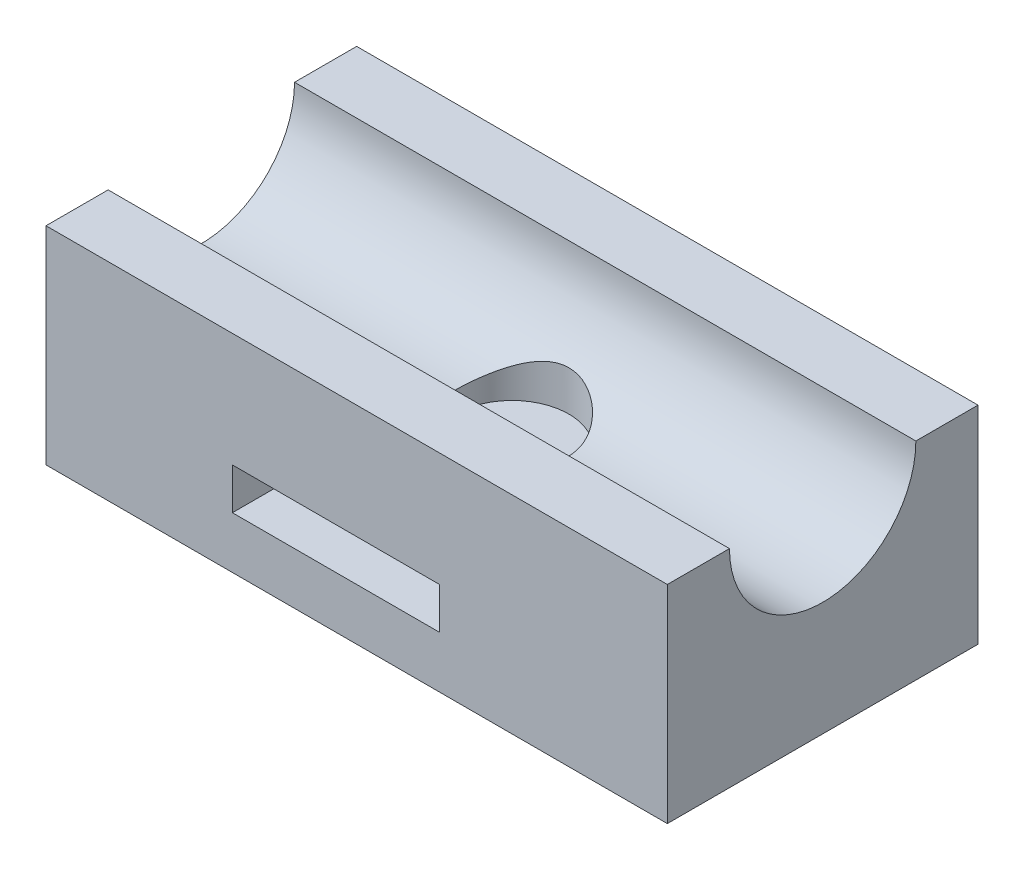
ISO-10303-21;
HEADER;
FILE_DESCRIPTION(('STEP AP214'),'2;1');
FILE_NAME('part.step','',(''),(''),'','','');
FILE_SCHEMA(('AUTOMOTIVE_DESIGN { 1 0 10303 214 1 1 1 1 }'));
ENDSEC;
DATA;
#1=APPLICATION_CONTEXT('core data for automotive mechanical design processes');
#2=APPLICATION_PROTOCOL_DEFINITION('international standard','automotive_design',2000,#1);
#3=PRODUCT_CONTEXT('',#1,'mechanical');
#4=PRODUCT('Part','Part','',(#3));
#5=PRODUCT_RELATED_PRODUCT_CATEGORY('part','',(#4));
#6=PRODUCT_DEFINITION_FORMATION('','',#4);
#7=PRODUCT_DEFINITION_CONTEXT('part definition',#1,'design');
#8=PRODUCT_DEFINITION('design','',#6,#7);
#9=PRODUCT_DEFINITION_SHAPE('','',#8);
#10=(LENGTH_UNIT() NAMED_UNIT(*) SI_UNIT(.MILLI.,.METRE.));
#11=(NAMED_UNIT(*) PLANE_ANGLE_UNIT() SI_UNIT($,.RADIAN.));
#12=(NAMED_UNIT(*) SI_UNIT($,.STERADIAN.) SOLID_ANGLE_UNIT());
#13=UNCERTAINTY_MEASURE_WITH_UNIT(LENGTH_MEASURE(1.E-05),#10,'distance_accuracy_value','');
#14=(GEOMETRIC_REPRESENTATION_CONTEXT(3) GLOBAL_UNCERTAINTY_ASSIGNED_CONTEXT((#13)) GLOBAL_UNIT_ASSIGNED_CONTEXT((#10,
#11,#12)) REPRESENTATION_CONTEXT('',''));
#15=CARTESIAN_POINT('',(0.,0.,0.));
#16=DIRECTION('',(0.,0.,1.));
#17=DIRECTION('',(1.,0.,0.));
#18=AXIS2_PLACEMENT_3D('',#15,#16,#17);
#19=CARTESIAN_POINT('',(76.189312979426,25.4,-19.05));
#20=DIRECTION('',(-1.,0.,0.));
#21=DIRECTION('',(0.,0.,1.));
#22=AXIS2_PLACEMENT_3D('',#19,#20,#21);
#23=CYLINDRICAL_SURFACE('',#22,11.43);
#24=DIRECTION('',(-1.,0.,0.));
#25=VECTOR('',#24,1.);
#26=CARTESIAN_POINT('',(76.189312979426,25.4,-30.48));
#27=LINE('',#26,#25);
#28=CARTESIAN_POINT('',(76.189312979426,25.4,-30.48));
#29=VERTEX_POINT('',#28);
#30=CARTESIAN_POINT('',(-0.0106870205739669,25.4,-30.48));
#31=VERTEX_POINT('',#30);
#32=EDGE_CURVE('E11',#29,#31,#27,.T.);
#33=ORIENTED_EDGE('',*,*,#32,.T.);
#34=CARTESIAN_POINT('',(-0.0106870205739669,25.4,-19.05));
#35=DIRECTION('',(-1.,0.,0.));
#36=DIRECTION('',(0.,0.,1.));
#37=AXIS2_PLACEMENT_3D('',#34,#35,#36);
#38=CIRCLE('',#37,11.43);
#39=CARTESIAN_POINT('',(-0.0106870205739682,25.4,-7.62000000000001));
#40=VERTEX_POINT('',#39);
#41=EDGE_CURVE('E152',#31,#40,#38,.T.);
#42=ORIENTED_EDGE('',*,*,#41,.T.);
#43=DIRECTION('',(-1.,0.,0.));
#44=VECTOR('',#43,1.);
#45=CARTESIAN_POINT('',(76.189312979426,25.4,-7.62));
#46=LINE('',#45,#44);
#47=CARTESIAN_POINT('',(76.189312979426,25.4,-7.62));
#48=VERTEX_POINT('',#47);
#49=EDGE_CURVE('E46',#40,#48,#46,.F.);
#50=ORIENTED_EDGE('',*,*,#49,.T.);
#51=CARTESIAN_POINT('',(76.189312979426,25.4,-19.05));
#52=DIRECTION('',(-1.,0.,0.));
#53=DIRECTION('',(0.,0.,1.));
#54=AXIS2_PLACEMENT_3D('',#51,#52,#53);
#55=CIRCLE('',#54,11.43);
#56=EDGE_CURVE('E156',#29,#48,#55,.T.);
#57=ORIENTED_EDGE('',*,*,#56,.F.);
#58=EDGE_LOOP('',(#33,#42,#50,#57));
#59=FACE_BOUND('',#58,.T.);
#60=CARTESIAN_POINT('',(38.089312979426,16.3526426510279,-12.065));
#61=CARTESIAN_POINT('',(38.2639668234599,16.3526396585141,-12.065001919476));
#62=CARTESIAN_POINT('',(38.4386749701658,16.3475630778701,-12.0715640351752));
#63=CARTESIAN_POINT('',(38.7866191019301,16.3274758428201,-12.0977006683469));
#64=CARTESIAN_POINT('',(38.959854017461,16.3124585072207,-12.1172839373921));
#65=CARTESIAN_POINT('',(39.3037279093829,16.2731037790766,-12.1691770968186));
#66=CARTESIAN_POINT('',(39.4743601423061,16.2487454222778,-12.2015156187813));
#67=CARTESIAN_POINT('',(39.8114888968901,16.1916920756502,-12.2784232673496));
#68=CARTESIAN_POINT('',(39.9779833257468,16.158992957784,-12.3229984509997));
#69=CARTESIAN_POINT('',(40.3043453402528,16.0867871961192,-12.4233306556903));
#70=CARTESIAN_POINT('',(40.464258543657,16.0473433809845,-12.4789851922237));
#71=CARTESIAN_POINT('',(40.7783582599086,15.962693785951,-12.6011493424653));
#72=CARTESIAN_POINT('',(40.932542579117,15.917485827685,-12.6676630627216));
#73=CARTESIAN_POINT('',(41.2345512658453,15.8225968686209,-12.8109601349127));
#74=CARTESIAN_POINT('',(41.3823781231747,15.772917642946,-12.8877394171766));
#75=CARTESIAN_POINT('',(41.67128820979,15.6703036956284,-13.0510632792636));
#76=CARTESIAN_POINT('',(41.8123712206878,15.6173688686852,-13.137608175025));
#77=CARTESIAN_POINT('',(42.2601747303282,15.441624573242,-13.4346125988456));
#78=CARTESIAN_POINT('',(42.552812437924,15.3144120855606,-13.6643990645323));
#79=CARTESIAN_POINT('',(42.9617221403863,15.1247623467679,-14.0415711564987));
#80=CARTESIAN_POINT('',(43.0931033164825,15.0616945348508,-14.1728193615056));
#81=CARTESIAN_POINT('',(43.3454297615247,14.9372383268811,-14.4458724009731));
#82=CARTESIAN_POINT('',(43.4663730606657,14.8758502493093,-14.5876792186589));
#83=CARTESIAN_POINT('',(43.7102409466186,14.7492987634795,-14.8980527684137));
#84=CARTESIAN_POINT('',(43.8318215455096,14.6845019985236,-15.067827627629));
#85=CARTESIAN_POINT('',(44.0600429002249,14.5604833680477,-15.4189638392426));
#86=CARTESIAN_POINT('',(44.1666903648136,14.5012590030553,-15.6003199350637));
#87=CARTESIAN_POINT('',(44.3639081375291,14.3900686115104,-15.9736035774017));
#88=CARTESIAN_POINT('',(44.454485719968,14.3380993031126,-16.1655262889373));
#89=CARTESIAN_POINT('',(44.6183990678219,14.2429760885947,-16.5586956966783));
#90=CARTESIAN_POINT('',(44.6917377982567,14.199820666686,-16.759940782331));
#91=CARTESIAN_POINT('',(44.8137144043605,14.1274631874209,-17.1499463506342));
#92=CARTESIAN_POINT('',(44.8640703374176,14.0973072505263,-17.3379930684081));
#93=CARTESIAN_POINT('',(44.9490709567566,14.0461548756158,-17.7188356297475));
#94=CARTESIAN_POINT('',(44.9837165789917,14.0251578919514,-17.9116311896757));
#95=CARTESIAN_POINT('',(45.0367063619675,13.9929623844108,-18.3001007278031));
#96=CARTESIAN_POINT('',(45.0550639581962,13.9817557848676,-18.4957721980466));
#97=CARTESIAN_POINT('',(45.0752039301503,13.9694584152379,-18.8882756570788));
#98=CARTESIAN_POINT('',(45.0769880875794,13.9683665577806,-19.0851075188449));
#99=CARTESIAN_POINT('',(45.0647988347553,13.975812270757,-19.4526950974293));
#100=CARTESIAN_POINT('',(45.0528239545497,13.9831285680965,-19.6235464182431));
#101=CARTESIAN_POINT('',(45.0164393917961,14.0052843097644,-19.9634280163946));
#102=CARTESIAN_POINT('',(44.9920298003194,14.0201236989938,-20.1324583070601));
#103=CARTESIAN_POINT('',(44.9310877646951,14.0569858705431,-20.4675117910474));
#104=CARTESIAN_POINT('',(44.8945554593298,14.0790085706274,-20.6335350187715));
#105=CARTESIAN_POINT('',(44.8098046734575,14.1297500968536,-20.9615207828606));
#106=CARTESIAN_POINT('',(44.7615857064554,14.1584692017533,-21.1234831498694));
#107=CARTESIAN_POINT('',(44.6537572867352,14.2221334424225,-21.4430840549721));
#108=CARTESIAN_POINT('',(44.5941014104774,14.2571039126024,-21.6007018683013));
#109=CARTESIAN_POINT('',(44.4641075833723,14.3324850339588,-21.910142877688));
#110=CARTESIAN_POINT('',(44.3937660799462,14.3728974938879,-22.0619641255161));
#111=CARTESIAN_POINT('',(44.1676187756904,14.50114798521,-22.5076398178329));
#112=CARTESIAN_POINT('',(43.996616268502,14.5960438382957,-22.7919226286299));
#113=CARTESIAN_POINT('',(43.5958120790448,14.8101908867528,-23.3633660014702));
#114=CARTESIAN_POINT('',(43.3613865346972,14.9310006864858,-23.6466635933695));
#115=CARTESIAN_POINT('',(42.8521131418012,15.1780015041597,-24.1725035279122));
#116=CARTESIAN_POINT('',(42.5772086442706,15.3041998845966,-24.414987717438));
#117=CARTESIAN_POINT('',(42.119962364464,15.4965344389314,-24.7584505521836));
#118=CARTESIAN_POINT('',(41.9498654300831,15.5647509239012,-24.8748662606916));
#119=CARTESIAN_POINT('',(41.5988184582199,15.6971720498169,-25.0928692482229));
#120=CARTESIAN_POINT('',(41.4178665311237,15.7613759882723,-25.1944539348634));
#121=CARTESIAN_POINT('',(41.0461862925386,15.8833299449572,-25.3816956794541));
#122=CARTESIAN_POINT('',(40.855473196954,15.9410895870605,-25.4673766184995));
#123=CARTESIAN_POINT('',(40.4650074043518,16.0478134453698,-25.6219355600296));
#124=CARTESIAN_POINT('',(40.265258440244,16.0967812528677,-25.6908204275158));
#125=CARTESIAN_POINT('',(39.9099788797993,16.17245923575,-25.795400436589));
#126=CARTESIAN_POINT('',(39.7561417879263,16.2016618891592,-25.8350803689406));
#127=CARTESIAN_POINT('',(39.4449946350117,16.2529226206363,-25.9040299576651));
#128=CARTESIAN_POINT('',(39.2876853825115,16.2749823436726,-25.9333020110543));
#129=CARTESIAN_POINT('',(38.9706920058058,16.3111749543637,-25.9810214982977));
#130=CARTESIAN_POINT('',(38.8110105080957,16.3253160226316,-25.9994801042345));
#131=CARTESIAN_POINT('',(38.490223143843,16.345179073953,-26.0253413297137));
#132=CARTESIAN_POINT('',(38.3291172502819,16.3509008969603,-26.0327437390825));
#133=CARTESIAN_POINT('',(38.0064194700094,16.3537040836083,-26.0363750267054));
#134=CARTESIAN_POINT('',(37.8448272270526,16.3507702158294,-26.0325842082258));
#135=CARTESIAN_POINT('',(37.5226798141752,16.336344483706,-26.0138485292706));
#136=CARTESIAN_POINT('',(37.3621246500269,16.3248525717696,-25.9989036067663));
#137=CARTESIAN_POINT('',(37.0431354686783,16.2937413662735,-25.9580828479593));
#138=CARTESIAN_POINT('',(36.8847025534814,16.2741180073035,-25.9322015437593));
#139=CARTESIAN_POINT('',(36.5709929761496,16.2274380664324,-25.8698621652715));
#140=CARTESIAN_POINT('',(36.4157176370165,16.2003784350051,-25.8333997514536));
#141=CARTESIAN_POINT('',(36.1104701606137,16.1399627622437,-25.7506870600189));
#142=CARTESIAN_POINT('',(35.9604650856894,16.1066599077936,-25.7045190891002));
#143=CARTESIAN_POINT('',(35.665047550913,16.0345742992433,-25.602678156496));
#144=CARTESIAN_POINT('',(35.5196366111133,15.9957897541853,-25.5470020871162));
#145=CARTESIAN_POINT('',(35.0911249823598,15.8727249090737,-25.3664193283414));
#146=CARTESIAN_POINT('',(34.8155970415561,15.781702315826,-25.2279172715139));
#147=CARTESIAN_POINT('',(34.238815933719,15.5716792831293,-24.8891423591995));
#148=CARTESIAN_POINT('',(33.9422396060329,15.4506186442418,-24.6821813028272));
#149=CARTESIAN_POINT('',(33.5244597849131,15.2670356932766,-24.3400666448813));
#150=CARTESIAN_POINT('',(33.3896180215879,15.2054598699312,-24.2206425257286));
#151=CARTESIAN_POINT('',(33.1293621519273,15.0828981506216,-23.9715397605156));
#152=CARTESIAN_POINT('',(33.0039497532065,15.0219123632441,-23.8418592657559));
#153=CARTESIAN_POINT('',(32.7458572202698,14.8931949882111,-23.5533710579603));
#154=CARTESIAN_POINT('',(32.6147162669765,14.8257510545812,-23.3930538832854));
#155=CARTESIAN_POINT('',(32.3665074643235,14.6951390805224,-23.060333655113));
#156=CARTESIAN_POINT('',(32.2494340842889,14.6319693639782,-22.8879353937848));
#157=CARTESIAN_POINT('',(32.0303796048417,14.5116128005951,-22.5318437407308));
#158=CARTESIAN_POINT('',(31.9283961562053,14.4544250228859,-22.3481521134899));
#159=CARTESIAN_POINT('',(31.740677249753,14.3476749620206,-21.9705290112218));
#160=CARTESIAN_POINT('',(31.6549396325128,14.2981116655701,-21.7765989014993));
#161=CARTESIAN_POINT('',(31.5061032863626,14.2111694143295,-21.393276651954));
#162=CARTESIAN_POINT('',(31.4418668995596,14.1731937523883,-21.2044621355291));
#163=CARTESIAN_POINT('',(31.3294722065202,14.1062813702306,-20.8205294884463));
#164=CARTESIAN_POINT('',(31.2813133903316,14.077344363326,-20.6254115579369));
#165=CARTESIAN_POINT('',(31.2018982466478,14.0294171404126,-20.2307681525804));
#166=CARTESIAN_POINT('',(31.1706245013598,14.0104166750035,-20.0312474414863));
#167=CARTESIAN_POINT('',(31.1254640426874,13.9829276062212,-19.6295391971772));
#168=CARTESIAN_POINT('',(31.1115748043633,13.9744374763204,-19.4273520555485));
#169=CARTESIAN_POINT('',(31.1021402490535,13.9686722387056,-19.0507501759414));
#170=CARTESIAN_POINT('',(31.104299489276,13.9699937261465,-18.8764092177358));
#171=CARTESIAN_POINT('',(31.1216238070552,13.9805727668959,-18.5286171052391));
#172=CARTESIAN_POINT('',(31.1367884428604,13.9898300506508,-18.3551659209266));
#173=CARTESIAN_POINT('',(31.1799154284448,14.0160570259333,-18.0104707834157));
#174=CARTESIAN_POINT('',(31.2078769957476,14.0330262459092,-17.8392266959211));
#175=CARTESIAN_POINT('',(31.2762317518109,14.0742766545714,-17.500139617793));
#176=CARTESIAN_POINT('',(31.3166252681202,14.0985580359135,-17.3322967168958));
#177=CARTESIAN_POINT('',(31.408235810001,14.1532161200772,-17.0051073533325));
#178=CARTESIAN_POINT('',(31.4591668178175,14.1834308497376,-16.8456535599444));
#179=CARTESIAN_POINT('',(31.5718752833561,14.2496815415154,-16.5318535891727));
#180=CARTESIAN_POINT('',(31.6336562792458,14.2857194022411,-16.3775090974991));
#181=CARTESIAN_POINT('',(31.8344136679747,14.4015272485442,-15.9233635629082));
#182=CARTESIAN_POINT('',(31.9888727224234,14.4890332292365,-15.6322100134547));
#183=CARTESIAN_POINT('',(32.3528230135778,14.6884929818972,-15.0482718930783));
#184=CARTESIAN_POINT('',(32.5664311347202,14.802059988633,-14.7586375179379));
#185=CARTESIAN_POINT('',(33.033606437667,15.0378533678655,-14.2169793326229));
#186=CARTESIAN_POINT('',(33.2872198306979,15.1600896635027,-13.9649996822162));
#187=CARTESIAN_POINT('',(33.7126370651777,15.3505687359981,-13.6024395221735));
#188=CARTESIAN_POINT('',(33.8724441311186,15.4193214204503,-13.477804567046));
#189=CARTESIAN_POINT('',(34.2029606306686,15.5544108077466,-13.2424456007179));
#190=CARTESIAN_POINT('',(34.3736720009311,15.6207470781212,-13.1317240710237));
#191=CARTESIAN_POINT('',(34.9010812068177,15.8129033205899,-12.8217254159522));
#192=CARTESIAN_POINT('',(35.2735777460187,15.9321174312719,-12.6441661721718));
#193=CARTESIAN_POINT('',(35.9659845285107,16.1113972258702,-12.3877343837164));
#194=CARTESIAN_POINT('',(36.2791167360396,16.1787236007496,-12.295687835068));
#195=CARTESIAN_POINT('',(36.759195346841,16.2567584339156,-12.1908571094342));
#196=CARTESIAN_POINT('',(36.9207767626856,16.2789329905398,-12.1614668466057));
#197=CARTESIAN_POINT('',(37.2464876826946,16.3149066492001,-12.1140865127403));
#198=CARTESIAN_POINT('',(37.4106156523887,16.3287106083258,-12.0960898302424));
#199=CARTESIAN_POINT('',(37.6607927284791,16.3429028460204,-12.0776300608214));
#200=CARTESIAN_POINT('',(37.7463738090045,16.3465504507111,-12.0728969109518));
#201=CARTESIAN_POINT('',(37.9177365289871,16.3514213114454,-12.0665811190005));
#202=CARTESIAN_POINT('',(38.0035182024673,16.352644121033,-12.0649990571005));
#203=CARTESIAN_POINT('',(38.089312979426,16.3526426510279,-12.065));
#204=B_SPLINE_CURVE_WITH_KNOTS('',3,(#60,#61,#62,#63,#64,#65,#66,#67,#68,#69,#70,#71,#72,#73,
#74,#75,#76,#77,#78,#79,#80,#81,#82,#83,#84,#85,#86,#87,#88,#89,#90,#91,#92,#93,#94,#95,#96,#97,
#98,#99,#100,#101,#102,#103,#104,#105,#106,#107,#108,#109,#110,#111,#112,#113,#114,#115,#116,
#117,#118,#119,#120,#121,#122,#123,#124,#125,#126,#127,#128,#129,#130,#131,#132,#133,#134,#135,
#136,#137,#138,#139,#140,#141,#142,#143,#144,#145,#146,#147,#148,#149,#150,#151,#152,#153,#154,
#155,#156,#157,#158,#159,#160,#161,#162,#163,#164,#165,#166,#167,#168,#169,#170,#171,#172,#173,
#174,#175,#176,#177,#178,#179,#180,#181,#182,#183,#184,#185,#186,#187,#188,#189,#190,#191,#192,
#193,#194,#195,#196,#197,#198,#199,#200,#201,#202,#203),.UNSPECIFIED.,.T.,.F.,(4,2,2,2,2,2,2,2,
2,2,2,2,2,2,2,2,2,2,2,2,2,2,2,2,2,2,2,2,2,2,2,2,2,2,2,2,2,2,2,2,2,2,2,2,2,2,2,2,2,2,2,2,2,2,2,2,
2,2,2,2,2,2,2,2,2,2,2,2,2,2,2,4),(0.,0.523861785478041,1.04807601707671,1.57347370527915,
2.09913193131605,2.62013658879214,3.14133872959329,3.66233485475122,4.18334784007696,
5.35753640255449,5.94549827306377,6.53357086046463,7.18863948984786,7.84341287654365,
8.49788910819977,9.1522526898251,9.74237959585624,10.3324713400256,10.9220758820628,
11.5116170387761,12.0252810378654,12.5389412749487,13.0525956317858,13.5662713748274,
14.0820780998549,14.5980566885237,15.6293220268434,16.7861345076548,17.9445815736102,
18.5952497750597,19.2460315739933,19.8958281093924,20.5453586087656,21.0294786436669,
21.5134871095852,21.9969946286176,22.4805113388018,22.964879400579,23.4492501559794,
23.9338633708339,24.4186756170823,24.8995313351113,25.3805445212912,26.342104181375,
27.4816288375172,28.0522948729933,28.623064005794,29.2757301136427,29.9281387799917,
30.5804457712453,31.2326659957949,31.8408510410007,32.4490167938237,33.0565539888782,
33.6640029344988,34.1864290776008,34.7088374762689,35.2312139362092,35.7536041605579,
36.2633348515542,36.7732320747906,37.7922743761094,38.9202079556135,40.0494541152898,
40.690798867635,41.3322578441178,42.6130069001315,43.6083644804034,44.1050029037086,
44.6013528731318,44.8586408379598,45.1159761705483),.UNSPECIFIED.);
#205=CARTESIAN_POINT('',(38.089312979426,16.3526426510279,-12.065));
#206=VERTEX_POINT('',#205);
#207=EDGE_CURVE('E197',#206,#206,#204,.T.);
#208=ORIENTED_EDGE('',*,*,#207,.F.);
#209=EDGE_LOOP('',(#208));
#210=FACE_BOUND('',#209,.T.);
#211=ADVANCED_FACE('F37',(#59,#210),#23,.F.);
#212=CARTESIAN_POINT('',(48.249312979426,11.43,0.));
#213=DIRECTION('',(0.,1.,0.));
#214=DIRECTION('',(0.,0.,1.));
#215=AXIS2_PLACEMENT_3D('',#212,#213,#214);
#216=PLANE('',#215);
#217=DIRECTION('',(1.,0.,0.));
#218=VECTOR('',#217,1.);
#219=CARTESIAN_POINT('',(48.249312979426,11.43,-38.1));
#220=LINE('',#219,#218);
#221=CARTESIAN_POINT('',(22.849312979426,11.43,-38.1));
#222=VERTEX_POINT('',#221);
#223=CARTESIAN_POINT('',(48.249312979426,11.43,-38.1));
#224=VERTEX_POINT('',#223);
#225=EDGE_CURVE('E133',#222,#224,#220,.T.);
#226=ORIENTED_EDGE('',*,*,#225,.T.);
#227=DIRECTION('',(0.,0.,-1.));
#228=VECTOR('',#227,1.);
#229=CARTESIAN_POINT('',(48.249312979426,11.43,0.));
#230=LINE('',#229,#228);
#231=CARTESIAN_POINT('',(48.249312979426,11.43,0.));
#232=VERTEX_POINT('',#231);
#233=EDGE_CURVE('E150',#232,#224,#230,.T.);
#234=ORIENTED_EDGE('',*,*,#233,.F.);
#235=DIRECTION('',(1.,0.,0.));
#236=VECTOR('',#235,1.);
#237=CARTESIAN_POINT('',(48.249312979426,11.43,0.));
#238=LINE('',#237,#236);
#239=CARTESIAN_POINT('',(22.849312979426,11.43,0.));
#240=VERTEX_POINT('',#239);
#241=EDGE_CURVE('E123',#240,#232,#238,.T.);
#242=ORIENTED_EDGE('',*,*,#241,.F.);
#243=DIRECTION('',(0.,0.,-1.));
#244=VECTOR('',#243,1.);
#245=CARTESIAN_POINT('',(22.849312979426,11.43,0.));
#246=LINE('',#245,#244);
#247=EDGE_CURVE('E153',#240,#222,#246,.T.);
#248=ORIENTED_EDGE('',*,*,#247,.T.);
#249=EDGE_LOOP('',(#226,#234,#242,#248));
#250=FACE_BOUND('',#249,.T.);
#251=CARTESIAN_POINT('',(38.089312979426,11.43,-19.05));
#252=DIRECTION('',(0.,1.,0.));
#253=DIRECTION('',(0.,0.,1.));
#254=AXIS2_PLACEMENT_3D('',#251,#252,#253);
#255=CIRCLE('',#254,6.985);
#256=CARTESIAN_POINT('',(38.089312979426,11.43,-12.065));
#257=VERTEX_POINT('',#256);
#258=EDGE_CURVE('E41',#257,#257,#255,.F.);
#259=ORIENTED_EDGE('',*,*,#258,.F.);
#260=EDGE_LOOP('',(#259));
#261=FACE_BOUND('',#260,.T.);
#262=ADVANCED_FACE('F220',(#250,#261),#216,.F.);
#263=CARTESIAN_POINT('',(0.,25.4,0.));
#264=DIRECTION('',(0.,1.,0.));
#265=DIRECTION('',(0.,0.,1.));
#266=AXIS2_PLACEMENT_3D('',#263,#264,#265);
#267=PLANE('',#266);
#268=ORIENTED_EDGE('',*,*,#32,.F.);
#269=DIRECTION('',(0.,0.,-1.));
#270=VECTOR('',#269,1.);
#271=CARTESIAN_POINT('',(76.189312979426,25.4,-38.1));
#272=LINE('',#271,#270);
#273=CARTESIAN_POINT('',(76.189312979426,25.4,-38.1));
#274=VERTEX_POINT('',#273);
#275=EDGE_CURVE('E167',#29,#274,#272,.T.);
#276=ORIENTED_EDGE('',*,*,#275,.T.);
#277=DIRECTION('',(-1.,0.,0.));
#278=VECTOR('',#277,1.);
#279=CARTESIAN_POINT('',(-0.0106870205739731,25.4,-38.1));
#280=LINE('',#279,#278);
#281=CARTESIAN_POINT('',(-0.0106870205739731,25.4,-38.1));
#282=VERTEX_POINT('',#281);
#283=EDGE_CURVE('E171',#274,#282,#280,.T.);
#284=ORIENTED_EDGE('',*,*,#283,.T.);
#285=DIRECTION('',(0.,0.,1.));
#286=VECTOR('',#285,1.);
#287=CARTESIAN_POINT('',(-0.0106870205739731,25.4,-38.1));
#288=LINE('',#287,#286);
#289=EDGE_CURVE('E161',#282,#31,#288,.T.);
#290=ORIENTED_EDGE('',*,*,#289,.T.);
#291=EDGE_LOOP('',(#268,#276,#284,#290));
#292=FACE_BOUND('',#291,.T.);
#293=ADVANCED_FACE('F223',(#292),#267,.T.);
#294=CARTESIAN_POINT('',(-0.0106870205739731,25.4,-38.1));
#295=DIRECTION('',(1.,0.,0.));
#296=DIRECTION('',(0.,0.,-1.));
#297=AXIS2_PLACEMENT_3D('',#294,#295,#296);
#298=PLANE('',#297);
#299=CARTESIAN_POINT('',(-0.0106870205739669,25.4,0.));
#300=VERTEX_POINT('',#299);
#301=EDGE_CURVE('E165',#40,#300,#288,.T.);
#302=ORIENTED_EDGE('',*,*,#301,.F.);
#303=ORIENTED_EDGE('',*,*,#41,.F.);
#304=ORIENTED_EDGE('',*,*,#289,.F.);
#305=DIRECTION('',(0.,-1.,0.));
#306=VECTOR('',#305,1.);
#307=CARTESIAN_POINT('',(-0.0106870205739731,25.4,-38.1));
#308=LINE('',#307,#306);
#309=CARTESIAN_POINT('',(-0.0106870205739731,0.,-38.1));
#310=VERTEX_POINT('',#309);
#311=EDGE_CURVE('E173',#282,#310,#308,.T.);
#312=ORIENTED_EDGE('',*,*,#311,.T.);
#313=DIRECTION('',(0.,0.,1.));
#314=VECTOR('',#313,1.);
#315=CARTESIAN_POINT('',(-0.0106870205739731,0.,-38.1));
#316=LINE('',#315,#314);
#317=CARTESIAN_POINT('',(-0.0106870205739669,0.,0.));
#318=VERTEX_POINT('',#317);
#319=EDGE_CURVE('E159',#310,#318,#316,.T.);
#320=ORIENTED_EDGE('',*,*,#319,.T.);
#321=DIRECTION('',(0.,-1.,0.));
#322=VECTOR('',#321,1.);
#323=CARTESIAN_POINT('',(-0.0106870205739669,25.4,0.));
#324=LINE('',#323,#322);
#325=EDGE_CURVE('E190',#300,#318,#324,.T.);
#326=ORIENTED_EDGE('',*,*,#325,.F.);
#327=EDGE_LOOP('',(#302,#303,#304,#312,#320,#326));
#328=FACE_BOUND('',#327,.T.);
#329=ADVANCED_FACE('F39',(#328),#298,.F.);
#330=CARTESIAN_POINT('',(-0.0106870205739669,25.4,0.));
#331=DIRECTION('',(0.,0.,-1.));
#332=DIRECTION('',(-1.,0.,0.));
#333=AXIS2_PLACEMENT_3D('',#330,#331,#332);
#334=PLANE('',#333);
#335=ORIENTED_EDGE('',*,*,#241,.T.);
#336=DIRECTION('',(0.,-1.,0.));
#337=VECTOR('',#336,1.);
#338=CARTESIAN_POINT('',(48.249312979426,11.43,0.));
#339=LINE('',#338,#337);
#340=CARTESIAN_POINT('',(48.249312979426,6.35,0.));
#341=VERTEX_POINT('',#340);
#342=EDGE_CURVE('E117',#232,#341,#339,.T.);
#343=ORIENTED_EDGE('',*,*,#342,.T.);
#344=DIRECTION('',(-1.,0.,0.));
#345=VECTOR('',#344,1.);
#346=CARTESIAN_POINT('',(48.249312979426,6.35,0.));
#347=LINE('',#346,#345);
#348=CARTESIAN_POINT('',(22.849312979426,6.35,0.));
#349=VERTEX_POINT('',#348);
#350=EDGE_CURVE('E126',#341,#349,#347,.T.);
#351=ORIENTED_EDGE('',*,*,#350,.T.);
#352=DIRECTION('',(0.,1.,0.));
#353=VECTOR('',#352,1.);
#354=CARTESIAN_POINT('',(22.849312979426,11.43,0.));
#355=LINE('',#354,#353);
#356=EDGE_CURVE('E54',#349,#240,#355,.T.);
#357=ORIENTED_EDGE('',*,*,#356,.T.);
#358=EDGE_LOOP('',(#335,#343,#351,#357));
#359=FACE_BOUND('',#358,.T.);
#360=DIRECTION('',(1.,0.,0.));
#361=VECTOR('',#360,1.);
#362=CARTESIAN_POINT('',(-0.0106870205739669,0.,0.));
#363=LINE('',#362,#361);
#364=CARTESIAN_POINT('',(76.189312979426,0.,0.));
#365=VERTEX_POINT('',#364);
#366=EDGE_CURVE('E176',#318,#365,#363,.T.);
#367=ORIENTED_EDGE('',*,*,#366,.T.);
#368=DIRECTION('',(0.,-1.,0.));
#369=VECTOR('',#368,1.);
#370=CARTESIAN_POINT('',(76.189312979426,25.4,0.));
#371=LINE('',#370,#369);
#372=CARTESIAN_POINT('',(76.189312979426,25.4,0.));
#373=VERTEX_POINT('',#372);
#374=EDGE_CURVE('E187',#373,#365,#371,.T.);
#375=ORIENTED_EDGE('',*,*,#374,.F.);
#376=DIRECTION('',(1.,0.,0.));
#377=VECTOR('',#376,1.);
#378=CARTESIAN_POINT('',(-0.0106870205739669,25.4,0.));
#379=LINE('',#378,#377);
#380=EDGE_CURVE('E164',#300,#373,#379,.T.);
#381=ORIENTED_EDGE('',*,*,#380,.F.);
#382=ORIENTED_EDGE('',*,*,#325,.T.);
#383=EDGE_LOOP('',(#367,#375,#381,#382));
#384=FACE_BOUND('',#383,.T.);
#385=ADVANCED_FACE('F130',(#359,#384),#334,.F.);
#386=CARTESIAN_POINT('',(76.189312979426,25.4,-38.1));
#387=DIRECTION('',(-1.,0.,0.));
#388=DIRECTION('',(0.,0.,1.));
#389=AXIS2_PLACEMENT_3D('',#386,#387,#388);
#390=PLANE('',#389);
#391=ORIENTED_EDGE('',*,*,#275,.F.);
#392=ORIENTED_EDGE('',*,*,#56,.T.);
#393=EDGE_CURVE('E168',#373,#48,#272,.T.);
#394=ORIENTED_EDGE('',*,*,#393,.F.);
#395=ORIENTED_EDGE('',*,*,#374,.T.);
#396=DIRECTION('',(0.,0.,-1.));
#397=VECTOR('',#396,1.);
#398=CARTESIAN_POINT('',(76.189312979426,0.,-38.1));
#399=LINE('',#398,#397);
#400=CARTESIAN_POINT('',(76.189312979426,0.,-38.1));
#401=VERTEX_POINT('',#400);
#402=EDGE_CURVE('E178',#365,#401,#399,.T.);
#403=ORIENTED_EDGE('',*,*,#402,.T.);
#404=DIRECTION('',(0.,-1.,0.));
#405=VECTOR('',#404,1.);
#406=CARTESIAN_POINT('',(76.189312979426,25.4,-38.1));
#407=LINE('',#406,#405);
#408=EDGE_CURVE('E184',#274,#401,#407,.T.);
#409=ORIENTED_EDGE('',*,*,#408,.F.);
#410=EDGE_LOOP('',(#391,#392,#394,#395,#403,#409));
#411=FACE_BOUND('',#410,.T.);
#412=ADVANCED_FACE('F265',(#411),#390,.F.);
#413=CARTESIAN_POINT('',(-0.0106870205739731,25.4,-38.1));
#414=DIRECTION('',(0.,0.,1.));
#415=DIRECTION('',(1.,0.,0.));
#416=AXIS2_PLACEMENT_3D('',#413,#414,#415);
#417=PLANE('',#416);
#418=DIRECTION('',(-1.,0.,0.));
#419=VECTOR('',#418,1.);
#420=CARTESIAN_POINT('',(48.249312979426,6.35,-38.1));
#421=LINE('',#420,#419);
#422=CARTESIAN_POINT('',(48.249312979426,6.35,-38.1));
#423=VERTEX_POINT('',#422);
#424=CARTESIAN_POINT('',(22.849312979426,6.35,-38.1));
#425=VERTEX_POINT('',#424);
#426=EDGE_CURVE('E145',#423,#425,#421,.T.);
#427=ORIENTED_EDGE('',*,*,#426,.F.);
#428=DIRECTION('',(0.,-1.,0.));
#429=VECTOR('',#428,1.);
#430=CARTESIAN_POINT('',(48.249312979426,11.43,-38.1));
#431=LINE('',#430,#429);
#432=EDGE_CURVE('E62',#224,#423,#431,.T.);
#433=ORIENTED_EDGE('',*,*,#432,.F.);
#434=ORIENTED_EDGE('',*,*,#225,.F.);
#435=DIRECTION('',(0.,1.,0.));
#436=VECTOR('',#435,1.);
#437=CARTESIAN_POINT('',(22.849312979426,11.43,-38.1));
#438=LINE('',#437,#436);
#439=EDGE_CURVE('E136',#425,#222,#438,.T.);
#440=ORIENTED_EDGE('',*,*,#439,.F.);
#441=EDGE_LOOP('',(#427,#433,#434,#440));
#442=FACE_BOUND('',#441,.T.);
#443=DIRECTION('',(-1.,0.,0.));
#444=VECTOR('',#443,1.);
#445=CARTESIAN_POINT('',(-0.0106870205739731,0.,-38.1));
#446=LINE('',#445,#444);
#447=EDGE_CURVE('E180',#401,#310,#446,.T.);
#448=ORIENTED_EDGE('',*,*,#447,.T.);
#449=ORIENTED_EDGE('',*,*,#311,.F.);
#450=ORIENTED_EDGE('',*,*,#283,.F.);
#451=ORIENTED_EDGE('',*,*,#408,.T.);
#452=EDGE_LOOP('',(#448,#449,#450,#451));
#453=FACE_BOUND('',#452,.T.);
#454=ADVANCED_FACE('F255',(#442,#453),#417,.F.);
#455=ORIENTED_EDGE('',*,*,#49,.F.);
#456=ORIENTED_EDGE('',*,*,#301,.T.);
#457=ORIENTED_EDGE('',*,*,#380,.T.);
#458=ORIENTED_EDGE('',*,*,#393,.T.);
#459=EDGE_LOOP('',(#455,#456,#457,#458));
#460=FACE_BOUND('',#459,.T.);
#461=ADVANCED_FACE('F234',(#460),#267,.T.);
#462=CARTESIAN_POINT('',(0.,0.,0.));
#463=DIRECTION('',(0.,1.,0.));
#464=DIRECTION('',(0.,0.,1.));
#465=AXIS2_PLACEMENT_3D('',#462,#463,#464);
#466=PLANE('',#465);
#467=CARTESIAN_POINT('',(38.089312979426,0.,-19.05));
#468=DIRECTION('',(0.,-1.,0.));
#469=DIRECTION('',(0.,0.,-1.));
#470=AXIS2_PLACEMENT_3D('',#467,#468,#469);
#471=CIRCLE('',#470,3.302);
#472=CARTESIAN_POINT('',(38.089312979426,0.,-22.352));
#473=VERTEX_POINT('',#472);
#474=EDGE_CURVE('E139',#473,#473,#471,.T.);
#475=ORIENTED_EDGE('',*,*,#474,.F.);
#476=EDGE_LOOP('',(#475));
#477=FACE_BOUND('',#476,.T.);
#478=ORIENTED_EDGE('',*,*,#319,.F.);
#479=ORIENTED_EDGE('',*,*,#447,.F.);
#480=ORIENTED_EDGE('',*,*,#402,.F.);
#481=ORIENTED_EDGE('',*,*,#366,.F.);
#482=EDGE_LOOP('',(#478,#479,#480,#481));
#483=FACE_BOUND('',#482,.T.);
#484=ADVANCED_FACE('F230',(#477,#483),#466,.F.);
#485=CARTESIAN_POINT('',(48.249312979426,11.43,0.));
#486=DIRECTION('',(1.,0.,0.));
#487=DIRECTION('',(0.,1.,0.));
#488=AXIS2_PLACEMENT_3D('',#485,#486,#487);
#489=PLANE('',#488);
#490=ORIENTED_EDGE('',*,*,#432,.T.);
#491=DIRECTION('',(0.,0.,-1.));
#492=VECTOR('',#491,1.);
#493=CARTESIAN_POINT('',(48.249312979426,6.35,0.));
#494=LINE('',#493,#492);
#495=EDGE_CURVE('E113',#341,#423,#494,.T.);
#496=ORIENTED_EDGE('',*,*,#495,.F.);
#497=ORIENTED_EDGE('',*,*,#342,.F.);
#498=ORIENTED_EDGE('',*,*,#233,.T.);
#499=EDGE_LOOP('',(#490,#496,#497,#498));
#500=FACE_BOUND('',#499,.T.);
#501=ADVANCED_FACE('F115',(#500),#489,.F.);
#502=CARTESIAN_POINT('',(22.849312979426,11.43,0.));
#503=DIRECTION('',(-1.,0.,0.));
#504=DIRECTION('',(0.,0.,1.));
#505=AXIS2_PLACEMENT_3D('',#502,#503,#504);
#506=PLANE('',#505);
#507=ORIENTED_EDGE('',*,*,#439,.T.);
#508=ORIENTED_EDGE('',*,*,#247,.F.);
#509=ORIENTED_EDGE('',*,*,#356,.F.);
#510=DIRECTION('',(0.,0.,-1.));
#511=VECTOR('',#510,1.);
#512=CARTESIAN_POINT('',(22.849312979426,6.35,0.));
#513=LINE('',#512,#511);
#514=EDGE_CURVE('E122',#349,#425,#513,.T.);
#515=ORIENTED_EDGE('',*,*,#514,.T.);
#516=EDGE_LOOP('',(#507,#508,#509,#515));
#517=FACE_BOUND('',#516,.T.);
#518=ADVANCED_FACE('F225',(#517),#506,.F.);
#519=CARTESIAN_POINT('',(48.249312979426,6.35,0.));
#520=DIRECTION('',(0.,-1.,0.));
#521=DIRECTION('',(0.,0.,-1.));
#522=AXIS2_PLACEMENT_3D('',#519,#520,#521);
#523=PLANE('',#522);
#524=CARTESIAN_POINT('',(38.089312979426,6.35,-19.05));
#525=DIRECTION('',(0.,-1.,0.));
#526=DIRECTION('',(0.,0.,-1.));
#527=AXIS2_PLACEMENT_3D('',#524,#525,#526);
#528=CIRCLE('',#527,3.302);
#529=CARTESIAN_POINT('',(38.089312979426,6.35,-22.352));
#530=VERTEX_POINT('',#529);
#531=EDGE_CURVE('E146',#530,#530,#528,.T.);
#532=ORIENTED_EDGE('',*,*,#531,.T.);
#533=EDGE_LOOP('',(#532));
#534=FACE_BOUND('',#533,.T.);
#535=ORIENTED_EDGE('',*,*,#426,.T.);
#536=ORIENTED_EDGE('',*,*,#514,.F.);
#537=ORIENTED_EDGE('',*,*,#350,.F.);
#538=ORIENTED_EDGE('',*,*,#495,.T.);
#539=EDGE_LOOP('',(#535,#536,#537,#538));
#540=FACE_BOUND('',#539,.T.);
#541=ADVANCED_FACE('F127',(#534,#540),#523,.F.);
#542=CARTESIAN_POINT('',(38.089312979426,25.4,-19.05));
#543=DIRECTION('',(0.,-1.,0.));
#544=DIRECTION('',(0.,0.,-1.));
#545=AXIS2_PLACEMENT_3D('',#542,#543,#544);
#546=CYLINDRICAL_SURFACE('',#545,3.302);
#547=ORIENTED_EDGE('',*,*,#474,.T.);
#548=EDGE_LOOP('',(#547));
#549=FACE_BOUND('',#548,.T.);
#550=ORIENTED_EDGE('',*,*,#531,.F.);
#551=EDGE_LOOP('',(#550));
#552=FACE_BOUND('',#551,.T.);
#553=ADVANCED_FACE('F216',(#549,#552),#546,.F.);
#554=CARTESIAN_POINT('',(38.089312979426,7.62,-19.05));
#555=DIRECTION('',(0.,1.,0.));
#556=DIRECTION('',(0.,0.,1.));
#557=AXIS2_PLACEMENT_3D('',#554,#555,#556);
#558=CYLINDRICAL_SURFACE('',#557,6.985);
#559=ORIENTED_EDGE('',*,*,#258,.T.);
#560=EDGE_LOOP('',(#559));
#561=FACE_BOUND('',#560,.T.);
#562=ORIENTED_EDGE('',*,*,#207,.T.);
#563=EDGE_LOOP('',(#562));
#564=FACE_BOUND('',#563,.T.);
#565=ADVANCED_FACE('F212',(#561,#564),#558,.F.);
#566=CLOSED_SHELL('',(#211,#262,#293,#329,#385,#412,#454,#461,#484,#501,#518,#541,#553,#565));
#567=MANIFOLD_SOLID_BREP('B2',#566);
#568=ADVANCED_BREP_SHAPE_REPRESENTATION('',(#18,#567),#14);
#569=SHAPE_DEFINITION_REPRESENTATION(#9,#568);
ENDSEC;
END-ISO-10303-21;
